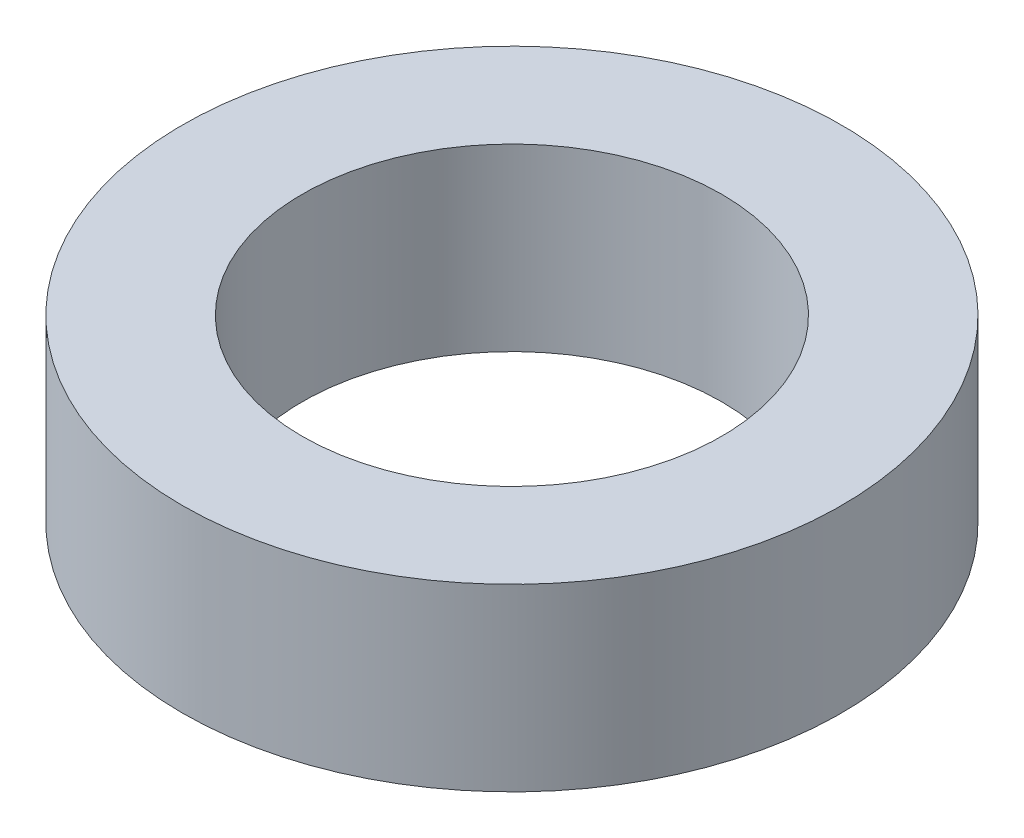
ISO-10303-21;
HEADER;
FILE_DESCRIPTION(('STEP AP214'),'2;1');
FILE_NAME('part.step','',(''),(''),'','','');
FILE_SCHEMA(('AUTOMOTIVE_DESIGN { 1 0 10303 214 1 1 1 1 }'));
ENDSEC;
DATA;
#1=APPLICATION_CONTEXT('core data for automotive mechanical design processes');
#2=APPLICATION_PROTOCOL_DEFINITION('international standard','automotive_design',2000,#1);
#3=PRODUCT_CONTEXT('',#1,'mechanical');
#4=PRODUCT('Part','Part','',(#3));
#5=PRODUCT_RELATED_PRODUCT_CATEGORY('part','',(#4));
#6=PRODUCT_DEFINITION_FORMATION('','',#4);
#7=PRODUCT_DEFINITION_CONTEXT('part definition',#1,'design');
#8=PRODUCT_DEFINITION('design','',#6,#7);
#9=PRODUCT_DEFINITION_SHAPE('','',#8);
#10=(LENGTH_UNIT() NAMED_UNIT(*) SI_UNIT(.MILLI.,.METRE.));
#11=(NAMED_UNIT(*) PLANE_ANGLE_UNIT() SI_UNIT($,.RADIAN.));
#12=(NAMED_UNIT(*) SI_UNIT($,.STERADIAN.) SOLID_ANGLE_UNIT());
#13=UNCERTAINTY_MEASURE_WITH_UNIT(LENGTH_MEASURE(1.E-05),#10,'distance_accuracy_value','');
#14=(GEOMETRIC_REPRESENTATION_CONTEXT(3) GLOBAL_UNCERTAINTY_ASSIGNED_CONTEXT((#13)) GLOBAL_UNIT_ASSIGNED_CONTEXT((#10,
#11,#12)) REPRESENTATION_CONTEXT('',''));
#15=CARTESIAN_POINT('',(0.,0.,0.));
#16=DIRECTION('',(0.,0.,1.));
#17=DIRECTION('',(1.,0.,0.));
#18=AXIS2_PLACEMENT_3D('',#15,#16,#17);
#19=CARTESIAN_POINT('',(0.,3.,0.));
#20=DIRECTION('',(0.,1.,0.));
#21=DIRECTION('',(0.,0.,1.));
#22=AXIS2_PLACEMENT_3D('',#19,#20,#21);
#23=PLANE('',#22);
#24=CARTESIAN_POINT('',(0.,3.,0.));
#25=DIRECTION('',(0.,1.,0.));
#26=DIRECTION('',(0.,0.,1.));
#27=AXIS2_PLACEMENT_3D('',#24,#25,#26);
#28=CIRCLE('',#27,5.5);
#29=CARTESIAN_POINT('',(0.,3.,5.5));
#30=VERTEX_POINT('',#29);
#31=EDGE_CURVE('E10',#30,#30,#28,.T.);
#32=ORIENTED_EDGE('',*,*,#31,.T.);
#33=EDGE_LOOP('',(#32));
#34=FACE_BOUND('',#33,.T.);
#35=CARTESIAN_POINT('',(0.,3.,0.));
#36=DIRECTION('',(0.,1.,0.));
#37=DIRECTION('',(0.,0.,1.));
#38=AXIS2_PLACEMENT_3D('',#35,#36,#37);
#39=CIRCLE('',#38,3.5);
#40=CARTESIAN_POINT('',(0.,3.,3.5));
#41=VERTEX_POINT('',#40);
#42=EDGE_CURVE('E45',#41,#41,#39,.T.);
#43=ORIENTED_EDGE('',*,*,#42,.F.);
#44=EDGE_LOOP('',(#43));
#45=FACE_BOUND('',#44,.T.);
#46=ADVANCED_FACE('F34',(#34,#45),#23,.T.);
#47=CARTESIAN_POINT('',(0.,0.,0.));
#48=DIRECTION('',(0.,1.,0.));
#49=DIRECTION('',(0.,0.,1.));
#50=AXIS2_PLACEMENT_3D('',#47,#48,#49);
#51=PLANE('',#50);
#52=CARTESIAN_POINT('',(0.,0.,0.));
#53=DIRECTION('',(0.,1.,0.));
#54=DIRECTION('',(0.,0.,1.));
#55=AXIS2_PLACEMENT_3D('',#52,#53,#54);
#56=CIRCLE('',#55,5.5);
#57=CARTESIAN_POINT('',(0.,0.,5.5));
#58=VERTEX_POINT('',#57);
#59=EDGE_CURVE('E38',#58,#58,#56,.T.);
#60=ORIENTED_EDGE('',*,*,#59,.F.);
#61=EDGE_LOOP('',(#60));
#62=FACE_BOUND('',#61,.T.);
#63=CARTESIAN_POINT('',(0.,0.,0.));
#64=DIRECTION('',(0.,1.,0.));
#65=DIRECTION('',(0.,0.,1.));
#66=AXIS2_PLACEMENT_3D('',#63,#64,#65);
#67=CIRCLE('',#66,3.5);
#68=CARTESIAN_POINT('',(0.,0.,3.5));
#69=VERTEX_POINT('',#68);
#70=EDGE_CURVE('E47',#69,#69,#67,.T.);
#71=ORIENTED_EDGE('',*,*,#70,.T.);
#72=EDGE_LOOP('',(#71));
#73=FACE_BOUND('',#72,.T.);
#74=ADVANCED_FACE('F57',(#62,#73),#51,.F.);
#75=CARTESIAN_POINT('',(0.,3.,0.));
#76=DIRECTION('',(0.,-1.,0.));
#77=DIRECTION('',(0.,0.,-1.));
#78=AXIS2_PLACEMENT_3D('',#75,#76,#77);
#79=CYLINDRICAL_SURFACE('',#78,5.5);
#80=ORIENTED_EDGE('',*,*,#31,.F.);
#81=EDGE_LOOP('',(#80));
#82=FACE_BOUND('',#81,.T.);
#83=ORIENTED_EDGE('',*,*,#59,.T.);
#84=EDGE_LOOP('',(#83));
#85=FACE_BOUND('',#84,.T.);
#86=ADVANCED_FACE('F36',(#82,#85),#79,.T.);
#87=CARTESIAN_POINT('',(0.,3.,0.));
#88=DIRECTION('',(0.,-1.,0.));
#89=DIRECTION('',(0.,0.,-1.));
#90=AXIS2_PLACEMENT_3D('',#87,#88,#89);
#91=CYLINDRICAL_SURFACE('',#90,3.5);
#92=ORIENTED_EDGE('',*,*,#42,.T.);
#93=EDGE_LOOP('',(#92));
#94=FACE_BOUND('',#93,.T.);
#95=ORIENTED_EDGE('',*,*,#70,.F.);
#96=EDGE_LOOP('',(#95));
#97=FACE_BOUND('',#96,.T.);
#98=ADVANCED_FACE('F53',(#94,#97),#91,.F.);
#99=CLOSED_SHELL('',(#46,#74,#86,#98));
#100=MANIFOLD_SOLID_BREP('B2',#99);
#101=ADVANCED_BREP_SHAPE_REPRESENTATION('',(#18,#100),#14);
#102=SHAPE_DEFINITION_REPRESENTATION(#9,#101);
ENDSEC;
END-ISO-10303-21;
